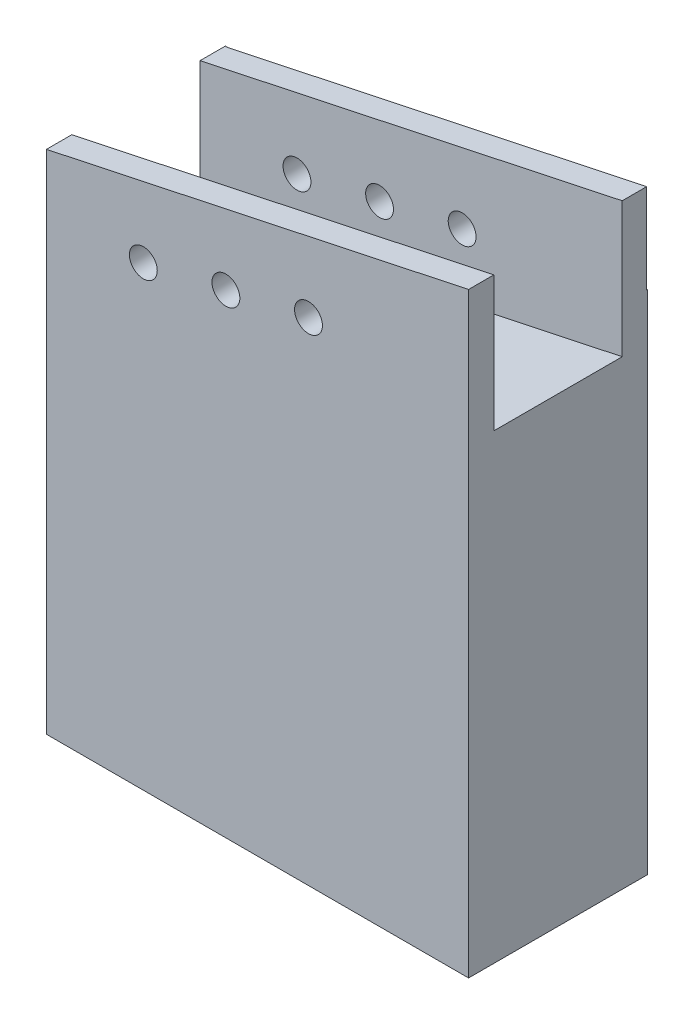
ISO-10303-21;
HEADER;
FILE_DESCRIPTION(('STEP AP214'),'2;1');
FILE_NAME('part.step','',(''),(''),'','','');
FILE_SCHEMA(('AUTOMOTIVE_DESIGN { 1 0 10303 214 1 1 1 1 }'));
ENDSEC;
DATA;
#1=APPLICATION_CONTEXT('core data for automotive mechanical design processes');
#2=APPLICATION_PROTOCOL_DEFINITION('international standard','automotive_design',2000,#1);
#3=PRODUCT_CONTEXT('',#1,'mechanical');
#4=PRODUCT('Part','Part','',(#3));
#5=PRODUCT_RELATED_PRODUCT_CATEGORY('part','',(#4));
#6=PRODUCT_DEFINITION_FORMATION('','',#4);
#7=PRODUCT_DEFINITION_CONTEXT('part definition',#1,'design');
#8=PRODUCT_DEFINITION('design','',#6,#7);
#9=PRODUCT_DEFINITION_SHAPE('','',#8);
#10=(LENGTH_UNIT() NAMED_UNIT(*) SI_UNIT(.MILLI.,.METRE.));
#11=(NAMED_UNIT(*) PLANE_ANGLE_UNIT() SI_UNIT($,.RADIAN.));
#12=(NAMED_UNIT(*) SI_UNIT($,.STERADIAN.) SOLID_ANGLE_UNIT());
#13=UNCERTAINTY_MEASURE_WITH_UNIT(LENGTH_MEASURE(1.E-05),#10,'distance_accuracy_value','');
#14=(GEOMETRIC_REPRESENTATION_CONTEXT(3) GLOBAL_UNCERTAINTY_ASSIGNED_CONTEXT((#13)) GLOBAL_UNIT_ASSIGNED_CONTEXT((#10,
#11,#12)) REPRESENTATION_CONTEXT('',''));
#15=CARTESIAN_POINT('',(0.,0.,0.));
#16=DIRECTION('',(0.,0.,1.));
#17=DIRECTION('',(1.,0.,0.));
#18=AXIS2_PLACEMENT_3D('',#15,#16,#17);
#19=CARTESIAN_POINT('',(25.,-30.,10.6));
#20=DIRECTION('',(-1.,0.,0.));
#21=DIRECTION('',(0.,0.,1.));
#22=AXIS2_PLACEMENT_3D('',#19,#20,#21);
#23=PLANE('',#22);
#24=DIRECTION('',(0.,0.,-1.));
#25=VECTOR('',#24,1.);
#26=CARTESIAN_POINT('',(25.,24.6278280835008,-7.6));
#27=LINE('',#26,#25);
#28=CARTESIAN_POINT('',(25.,24.6278280835008,7.6));
#29=VERTEX_POINT('',#28);
#30=CARTESIAN_POINT('',(25.,24.6278280835008,-7.6));
#31=VERTEX_POINT('',#30);
#32=EDGE_CURVE('E160',#29,#31,#27,.T.);
#33=ORIENTED_EDGE('',*,*,#32,.F.);
#34=DIRECTION('',(0.,1.,0.));
#35=VECTOR('',#34,1.);
#36=CARTESIAN_POINT('',(25.,40.6278280835008,7.6));
#37=LINE('',#36,#35);
#38=CARTESIAN_POINT('',(25.,40.6278280835008,7.6));
#39=VERTEX_POINT('',#38);
#40=EDGE_CURVE('E126',#29,#39,#37,.T.);
#41=ORIENTED_EDGE('',*,*,#40,.T.);
#42=DIRECTION('',(0.,0.,1.));
#43=VECTOR('',#42,1.);
#44=CARTESIAN_POINT('',(25.,40.6278280835008,7.6));
#45=LINE('',#44,#43);
#46=CARTESIAN_POINT('',(25.,40.6278280835008,10.6));
#47=VERTEX_POINT('',#46);
#48=EDGE_CURVE('E182',#39,#47,#45,.T.);
#49=ORIENTED_EDGE('',*,*,#48,.T.);
#50=DIRECTION('',(0.,1.,0.));
#51=VECTOR('',#50,1.);
#52=CARTESIAN_POINT('',(25.,-30.,10.6));
#53=LINE('',#52,#51);
#54=CARTESIAN_POINT('',(25.,-30.,10.6));
#55=VERTEX_POINT('',#54);
#56=EDGE_CURVE('E192',#55,#47,#53,.T.);
#57=ORIENTED_EDGE('',*,*,#56,.F.);
#58=DIRECTION('',(0.,0.,-1.));
#59=VECTOR('',#58,1.);
#60=CARTESIAN_POINT('',(25.,-30.,10.6));
#61=LINE('',#60,#59);
#62=CARTESIAN_POINT('',(25.,-30.,-10.6));
#63=VERTEX_POINT('',#62);
#64=EDGE_CURVE('E202',#55,#63,#61,.T.);
#65=ORIENTED_EDGE('',*,*,#64,.T.);
#66=DIRECTION('',(0.,1.,0.));
#67=VECTOR('',#66,1.);
#68=CARTESIAN_POINT('',(25.,-30.,-10.6));
#69=LINE('',#68,#67);
#70=CARTESIAN_POINT('',(25.,30.,-10.6));
#71=VERTEX_POINT('',#70);
#72=EDGE_CURVE('E188',#63,#71,#69,.T.);
#73=ORIENTED_EDGE('',*,*,#72,.T.);
#74=DIRECTION('',(0.,0.,-1.));
#75=VECTOR('',#74,1.);
#76=CARTESIAN_POINT('',(25.,30.,10.6));
#77=LINE('',#76,#75);
#78=CARTESIAN_POINT('',(25.,30.,-10.5));
#79=VERTEX_POINT('',#78);
#80=EDGE_CURVE('E11',#79,#71,#77,.T.);
#81=ORIENTED_EDGE('',*,*,#80,.F.);
#82=DIRECTION('',(0.,1.,0.));
#83=VECTOR('',#82,1.);
#84=CARTESIAN_POINT('',(25.,40.6278280835008,-10.5));
#85=LINE('',#84,#83);
#86=CARTESIAN_POINT('',(25.,40.6278280835008,-10.5));
#87=VERTEX_POINT('',#86);
#88=EDGE_CURVE('E67',#79,#87,#85,.T.);
#89=ORIENTED_EDGE('',*,*,#88,.T.);
#90=DIRECTION('',(0.,0.,1.));
#91=VECTOR('',#90,1.);
#92=CARTESIAN_POINT('',(25.,40.6278280835008,-10.5));
#93=LINE('',#92,#91);
#94=CARTESIAN_POINT('',(25.,40.6278280835008,-7.6));
#95=VERTEX_POINT('',#94);
#96=EDGE_CURVE('E169',#87,#95,#93,.T.);
#97=ORIENTED_EDGE('',*,*,#96,.T.);
#98=DIRECTION('',(0.,1.,0.));
#99=VECTOR('',#98,1.);
#100=CARTESIAN_POINT('',(25.,24.8404350956593,-7.6));
#101=LINE('',#100,#99);
#102=EDGE_CURVE('E145',#31,#95,#101,.T.);
#103=ORIENTED_EDGE('',*,*,#102,.F.);
#104=EDGE_LOOP('',(#33,#41,#49,#57,#65,#73,#81,#89,#97,#103));
#105=FACE_BOUND('',#104,.T.);
#106=ADVANCED_FACE('F50',(#105),#23,.F.);
#107=CARTESIAN_POINT('',(-25.,-30.,10.6));
#108=DIRECTION('',(1.,0.,0.));
#109=DIRECTION('',(0.,0.,-1.));
#110=AXIS2_PLACEMENT_3D('',#107,#108,#109);
#111=PLANE('',#110);
#112=DIRECTION('',(0.,1.,0.));
#113=VECTOR('',#112,1.);
#114=CARTESIAN_POINT('',(-25.,24.8404350956593,7.6));
#115=LINE('',#114,#113);
#116=CARTESIAN_POINT('',(-25.,14.,7.6));
#117=VERTEX_POINT('',#116);
#118=CARTESIAN_POINT('',(-25.,30.,7.6));
#119=VERTEX_POINT('',#118);
#120=EDGE_CURVE('E127',#117,#119,#115,.T.);
#121=ORIENTED_EDGE('',*,*,#120,.F.);
#122=DIRECTION('',(0.,0.,1.));
#123=VECTOR('',#122,1.);
#124=CARTESIAN_POINT('',(-25.,14.,-7.6));
#125=LINE('',#124,#123);
#126=CARTESIAN_POINT('',(-25.,14.,-7.6));
#127=VERTEX_POINT('',#126);
#128=EDGE_CURVE('E140',#127,#117,#125,.T.);
#129=ORIENTED_EDGE('',*,*,#128,.F.);
#130=DIRECTION('',(0.,-1.,0.));
#131=VECTOR('',#130,1.);
#132=CARTESIAN_POINT('',(-25.,24.8404350956593,-7.6));
#133=LINE('',#132,#131);
#134=CARTESIAN_POINT('',(-25.,30.,-7.6));
#135=VERTEX_POINT('',#134);
#136=EDGE_CURVE('E65',#135,#127,#133,.T.);
#137=ORIENTED_EDGE('',*,*,#136,.F.);
#138=DIRECTION('',(0.,0.,1.));
#139=VECTOR('',#138,1.);
#140=CARTESIAN_POINT('',(-25.,30.,-10.5));
#141=LINE('',#140,#139);
#142=CARTESIAN_POINT('',(-25.,30.,-10.5));
#143=VERTEX_POINT('',#142);
#144=EDGE_CURVE('E167',#143,#135,#141,.T.);
#145=ORIENTED_EDGE('',*,*,#144,.F.);
#146=DIRECTION('',(0.,0.,-1.));
#147=VECTOR('',#146,1.);
#148=CARTESIAN_POINT('',(-25.,30.,10.6));
#149=LINE('',#148,#147);
#150=CARTESIAN_POINT('',(-25.,30.,-10.6));
#151=VERTEX_POINT('',#150);
#152=EDGE_CURVE('E217',#143,#151,#149,.T.);
#153=ORIENTED_EDGE('',*,*,#152,.T.);
#154=DIRECTION('',(0.,-1.,0.));
#155=VECTOR('',#154,1.);
#156=CARTESIAN_POINT('',(-25.,-30.,-10.6));
#157=LINE('',#156,#155);
#158=CARTESIAN_POINT('',(-25.,-30.,-10.6));
#159=VERTEX_POINT('',#158);
#160=EDGE_CURVE('E209',#151,#159,#157,.T.);
#161=ORIENTED_EDGE('',*,*,#160,.T.);
#162=DIRECTION('',(0.,0.,-1.));
#163=VECTOR('',#162,1.);
#164=CARTESIAN_POINT('',(-25.,-30.,10.6));
#165=LINE('',#164,#163);
#166=CARTESIAN_POINT('',(-25.,-30.,10.6));
#167=VERTEX_POINT('',#166);
#168=EDGE_CURVE('E216',#167,#159,#165,.T.);
#169=ORIENTED_EDGE('',*,*,#168,.F.);
#170=DIRECTION('',(0.,-1.,0.));
#171=VECTOR('',#170,1.);
#172=CARTESIAN_POINT('',(-25.,-30.,10.6));
#173=LINE('',#172,#171);
#174=CARTESIAN_POINT('',(-25.,30.,10.6));
#175=VERTEX_POINT('',#174);
#176=EDGE_CURVE('E191',#175,#167,#173,.T.);
#177=ORIENTED_EDGE('',*,*,#176,.F.);
#178=EDGE_CURVE('E54',#175,#119,#149,.T.);
#179=ORIENTED_EDGE('',*,*,#178,.T.);
#180=EDGE_LOOP('',(#121,#129,#137,#145,#153,#161,#169,#177,#179));
#181=FACE_BOUND('',#180,.T.);
#182=ADVANCED_FACE('F143',(#181),#111,.F.);
#183=CARTESIAN_POINT('',(-25.,30.,10.6));
#184=DIRECTION('',(0.,-1.,0.));
#185=DIRECTION('',(0.,0.,-1.));
#186=AXIS2_PLACEMENT_3D('',#183,#184,#185);
#187=PLANE('',#186);
#188=ORIENTED_EDGE('',*,*,#152,.F.);
#189=DIRECTION('',(1.,0.,0.));
#190=VECTOR('',#189,1.);
#191=CARTESIAN_POINT('',(25.,30.,-10.5));
#192=LINE('',#191,#190);
#193=EDGE_CURVE('E156',#143,#79,#192,.T.);
#194=ORIENTED_EDGE('',*,*,#193,.T.);
#195=ORIENTED_EDGE('',*,*,#80,.T.);
#196=DIRECTION('',(-1.,0.,0.));
#197=VECTOR('',#196,1.);
#198=CARTESIAN_POINT('',(-25.,30.,-10.6));
#199=LINE('',#198,#197);
#200=EDGE_CURVE('E201',#71,#151,#199,.T.);
#201=ORIENTED_EDGE('',*,*,#200,.T.);
#202=EDGE_LOOP('',(#188,#194,#195,#201));
#203=FACE_BOUND('',#202,.T.);
#204=ADVANCED_FACE('F230',(#203),#187,.F.);
#205=CARTESIAN_POINT('',(-25.,-30.,10.6));
#206=DIRECTION('',(0.,1.,0.));
#207=DIRECTION('',(0.,0.,1.));
#208=AXIS2_PLACEMENT_3D('',#205,#206,#207);
#209=PLANE('',#208);
#210=DIRECTION('',(1.,0.,0.));
#211=VECTOR('',#210,1.);
#212=CARTESIAN_POINT('',(-25.,-30.,-10.6));
#213=LINE('',#212,#211);
#214=EDGE_CURVE('E193',#159,#63,#213,.T.);
#215=ORIENTED_EDGE('',*,*,#214,.T.);
#216=ORIENTED_EDGE('',*,*,#64,.F.);
#217=DIRECTION('',(1.,0.,0.));
#218=VECTOR('',#217,1.);
#219=CARTESIAN_POINT('',(-25.,-30.,10.6));
#220=LINE('',#219,#218);
#221=EDGE_CURVE('E200',#167,#55,#220,.T.);
#222=ORIENTED_EDGE('',*,*,#221,.F.);
#223=ORIENTED_EDGE('',*,*,#168,.T.);
#224=EDGE_LOOP('',(#215,#216,#222,#223));
#225=FACE_BOUND('',#224,.T.);
#226=ADVANCED_FACE('F240',(#225),#209,.F.);
#227=CARTESIAN_POINT('',(0.,0.,10.6));
#228=DIRECTION('',(0.,0.,-1.));
#229=DIRECTION('',(-1.,0.,0.));
#230=AXIS2_PLACEMENT_3D('',#227,#228,#229);
#231=PLANE('',#230);
#232=CARTESIAN_POINT('',(-13.5239685291888,24.1068602525402,10.6));
#233=DIRECTION('',(0.,0.,1.));
#234=DIRECTION('',(1.,0.,0.));
#235=AXIS2_PLACEMENT_3D('',#232,#233,#234);
#236=CIRCLE('',#235,1.65);
#237=CARTESIAN_POINT('',(-11.8739685291888,24.1068602525402,10.6));
#238=VERTEX_POINT('',#237);
#239=EDGE_CURVE('E332',#238,#238,#236,.T.);
#240=ORIENTED_EDGE('',*,*,#239,.F.);
#241=EDGE_LOOP('',(#240));
#242=FACE_BOUND('',#241,.T.);
#243=CARTESIAN_POINT('',(-3.74249252185072,26.1859771607178,10.6));
#244=DIRECTION('',(0.,0.,1.));
#245=DIRECTION('',(1.,0.,0.));
#246=AXIS2_PLACEMENT_3D('',#243,#244,#245);
#247=CIRCLE('',#246,1.65);
#248=CARTESIAN_POINT('',(-2.09249252185072,26.1859771607178,10.6));
#249=VERTEX_POINT('',#248);
#250=EDGE_CURVE('E338',#249,#249,#247,.T.);
#251=ORIENTED_EDGE('',*,*,#250,.F.);
#252=EDGE_LOOP('',(#251));
#253=FACE_BOUND('',#252,.T.);
#254=CARTESIAN_POINT('',(6.03898348548735,28.2650940688953,10.6));
#255=DIRECTION('',(0.,0.,1.));
#256=DIRECTION('',(1.,0.,0.));
#257=AXIS2_PLACEMENT_3D('',#254,#255,#256);
#258=CIRCLE('',#257,1.65);
#259=CARTESIAN_POINT('',(7.68898348548735,28.2650940688953,10.6));
#260=VERTEX_POINT('',#259);
#261=EDGE_CURVE('E305',#260,#260,#258,.T.);
#262=ORIENTED_EDGE('',*,*,#261,.F.);
#263=EDGE_LOOP('',(#262));
#264=FACE_BOUND('',#263,.T.);
#265=ORIENTED_EDGE('',*,*,#56,.T.);
#266=DIRECTION('',(-0.978147600733807,-0.207911690817753,0.));
#267=VECTOR('',#266,1.);
#268=CARTESIAN_POINT('',(-25.,30.,10.6));
#269=LINE('',#268,#267);
#270=EDGE_CURVE('E172',#47,#175,#269,.T.);
#271=ORIENTED_EDGE('',*,*,#270,.T.);
#272=ORIENTED_EDGE('',*,*,#176,.T.);
#273=ORIENTED_EDGE('',*,*,#221,.T.);
#274=EDGE_LOOP('',(#265,#271,#272,#273));
#275=FACE_BOUND('',#274,.T.);
#276=ADVANCED_FACE('F243',(#242,#253,#264,#275),#231,.F.);
#277=CARTESIAN_POINT('',(0.,0.,-10.6));
#278=DIRECTION('',(0.,0.,-1.));
#279=DIRECTION('',(-1.,0.,0.));
#280=AXIS2_PLACEMENT_3D('',#277,#278,#279);
#281=PLANE('',#280);
#282=CARTESIAN_POINT('',(-13.5239685291888,24.1068602525402,-10.6));
#283=DIRECTION('',(0.,0.,1.));
#284=DIRECTION('',(1.,0.,0.));
#285=AXIS2_PLACEMENT_3D('',#282,#283,#284);
#286=CIRCLE('',#285,1.65);
#287=CARTESIAN_POINT('',(-11.8739685291888,24.1068602525402,-10.6));
#288=VERTEX_POINT('',#287);
#289=EDGE_CURVE('E133',#288,#288,#286,.T.);
#290=ORIENTED_EDGE('',*,*,#289,.T.);
#291=EDGE_LOOP('',(#290));
#292=FACE_BOUND('',#291,.T.);
#293=CARTESIAN_POINT('',(-3.74249252185072,26.1859771607178,-10.6));
#294=DIRECTION('',(0.,0.,1.));
#295=DIRECTION('',(1.,0.,0.));
#296=AXIS2_PLACEMENT_3D('',#293,#294,#295);
#297=CIRCLE('',#296,1.65);
#298=CARTESIAN_POINT('',(-2.09249252185072,26.1859771607178,-10.6));
#299=VERTEX_POINT('',#298);
#300=EDGE_CURVE('E318',#299,#299,#297,.T.);
#301=ORIENTED_EDGE('',*,*,#300,.T.);
#302=EDGE_LOOP('',(#301));
#303=FACE_BOUND('',#302,.T.);
#304=CARTESIAN_POINT('',(6.03898348548735,28.2650940688953,-10.6));
#305=DIRECTION('',(0.,0.,1.));
#306=DIRECTION('',(1.,0.,0.));
#307=AXIS2_PLACEMENT_3D('',#304,#305,#306);
#308=CIRCLE('',#307,1.65);
#309=CARTESIAN_POINT('',(7.68898348548735,28.2650940688953,-10.6));
#310=VERTEX_POINT('',#309);
#311=EDGE_CURVE('E330',#310,#310,#308,.T.);
#312=ORIENTED_EDGE('',*,*,#311,.T.);
#313=EDGE_LOOP('',(#312));
#314=FACE_BOUND('',#313,.T.);
#315=ORIENTED_EDGE('',*,*,#72,.F.);
#316=ORIENTED_EDGE('',*,*,#214,.F.);
#317=ORIENTED_EDGE('',*,*,#160,.F.);
#318=ORIENTED_EDGE('',*,*,#200,.F.);
#319=EDGE_LOOP('',(#315,#316,#317,#318));
#320=FACE_BOUND('',#319,.T.);
#321=ADVANCED_FACE('F234',(#292,#303,#314,#320),#281,.T.);
#322=CARTESIAN_POINT('',(-25.,30.,7.6));
#323=DIRECTION('',(-0.207911690817753,0.978147600733807,0.));
#324=DIRECTION('',(-0.978147600733807,-0.207911690817753,0.));
#325=AXIS2_PLACEMENT_3D('',#322,#323,#324);
#326=PLANE('',#325);
#327=ORIENTED_EDGE('',*,*,#270,.F.);
#328=ORIENTED_EDGE('',*,*,#48,.F.);
#329=DIRECTION('',(-0.978147600733807,-0.207911690817753,0.));
#330=VECTOR('',#329,1.);
#331=CARTESIAN_POINT('',(-25.,30.,7.6));
#332=LINE('',#331,#330);
#333=EDGE_CURVE('E179',#39,#119,#332,.T.);
#334=ORIENTED_EDGE('',*,*,#333,.T.);
#335=ORIENTED_EDGE('',*,*,#178,.F.);
#336=EDGE_LOOP('',(#327,#328,#334,#335));
#337=FACE_BOUND('',#336,.T.);
#338=ADVANCED_FACE('F244',(#337),#326,.T.);
#339=CARTESIAN_POINT('',(0.,0.,7.6));
#340=DIRECTION('',(0.,0.,1.));
#341=DIRECTION('',(1.,0.,0.));
#342=AXIS2_PLACEMENT_3D('',#339,#340,#341);
#343=PLANE('',#342);
#344=CARTESIAN_POINT('',(-13.5239685291888,24.1068602525402,7.6));
#345=DIRECTION('',(0.,0.,1.));
#346=DIRECTION('',(1.,0.,0.));
#347=AXIS2_PLACEMENT_3D('',#344,#345,#346);
#348=CIRCLE('',#347,1.65);
#349=CARTESIAN_POINT('',(-11.8739685291888,24.1068602525402,7.6));
#350=VERTEX_POINT('',#349);
#351=EDGE_CURVE('E292',#350,#350,#348,.T.);
#352=ORIENTED_EDGE('',*,*,#351,.T.);
#353=EDGE_LOOP('',(#352));
#354=FACE_BOUND('',#353,.T.);
#355=CARTESIAN_POINT('',(-3.74249252185072,26.1859771607178,7.6));
#356=DIRECTION('',(0.,0.,1.));
#357=DIRECTION('',(1.,0.,0.));
#358=AXIS2_PLACEMENT_3D('',#355,#356,#357);
#359=CIRCLE('',#358,1.65);
#360=CARTESIAN_POINT('',(-2.09249252185072,26.1859771607178,7.6));
#361=VERTEX_POINT('',#360);
#362=EDGE_CURVE('E298',#361,#361,#359,.T.);
#363=ORIENTED_EDGE('',*,*,#362,.T.);
#364=EDGE_LOOP('',(#363));
#365=FACE_BOUND('',#364,.T.);
#366=CARTESIAN_POINT('',(6.03898348548735,28.2650940688953,7.6));
#367=DIRECTION('',(0.,0.,1.));
#368=DIRECTION('',(1.,0.,0.));
#369=AXIS2_PLACEMENT_3D('',#366,#367,#368);
#370=CIRCLE('',#369,1.65);
#371=CARTESIAN_POINT('',(7.68898348548735,28.2650940688953,7.6));
#372=VERTEX_POINT('',#371);
#373=EDGE_CURVE('E299',#372,#372,#370,.T.);
#374=ORIENTED_EDGE('',*,*,#373,.T.);
#375=EDGE_LOOP('',(#374));
#376=FACE_BOUND('',#375,.T.);
#377=ORIENTED_EDGE('',*,*,#40,.F.);
#378=DIRECTION('',(-0.978147600733807,-0.207911690817753,0.));
#379=VECTOR('',#378,1.);
#380=CARTESIAN_POINT('',(26.0002373508875,24.8404350956593,7.6));
#381=LINE('',#380,#379);
#382=EDGE_CURVE('E122',#29,#117,#381,.T.);
#383=ORIENTED_EDGE('',*,*,#382,.T.);
#384=ORIENTED_EDGE('',*,*,#120,.T.);
#385=ORIENTED_EDGE('',*,*,#333,.F.);
#386=EDGE_LOOP('',(#377,#383,#384,#385));
#387=FACE_BOUND('',#386,.T.);
#388=ADVANCED_FACE('F124',(#354,#365,#376,#387),#343,.F.);
#389=CARTESIAN_POINT('',(-25.,30.,-10.5));
#390=DIRECTION('',(-0.207911690817753,0.978147600733807,0.));
#391=DIRECTION('',(-0.978147600733807,-0.207911690817753,0.));
#392=AXIS2_PLACEMENT_3D('',#389,#390,#391);
#393=PLANE('',#392);
#394=DIRECTION('',(-0.978147600733807,-0.207911690817753,0.));
#395=VECTOR('',#394,1.);
#396=CARTESIAN_POINT('',(26.0002373508875,40.8404350956594,-7.6));
#397=LINE('',#396,#395);
#398=EDGE_CURVE('E135',#95,#135,#397,.T.);
#399=ORIENTED_EDGE('',*,*,#398,.F.);
#400=ORIENTED_EDGE('',*,*,#96,.F.);
#401=DIRECTION('',(-0.978147600733807,-0.207911690817753,0.));
#402=VECTOR('',#401,1.);
#403=CARTESIAN_POINT('',(-25.,30.,-10.5));
#404=LINE('',#403,#402);
#405=EDGE_CURVE('E164',#87,#143,#404,.T.);
#406=ORIENTED_EDGE('',*,*,#405,.T.);
#407=ORIENTED_EDGE('',*,*,#144,.T.);
#408=EDGE_LOOP('',(#399,#400,#406,#407));
#409=FACE_BOUND('',#408,.T.);
#410=ADVANCED_FACE('F252',(#409),#393,.T.);
#411=CARTESIAN_POINT('',(0.,0.,-10.5));
#412=DIRECTION('',(0.,0.,1.));
#413=DIRECTION('',(1.,0.,0.));
#414=AXIS2_PLACEMENT_3D('',#411,#412,#413);
#415=PLANE('',#414);
#416=ORIENTED_EDGE('',*,*,#193,.F.);
#417=ORIENTED_EDGE('',*,*,#405,.F.);
#418=ORIENTED_EDGE('',*,*,#88,.F.);
#419=EDGE_LOOP('',(#416,#417,#418));
#420=FACE_BOUND('',#419,.T.);
#421=ADVANCED_FACE('F255',(#420),#415,.F.);
#422=CARTESIAN_POINT('',(26.0002373508875,24.8404350956593,-7.6));
#423=DIRECTION('',(0.,0.,-1.));
#424=DIRECTION('',(-1.,0.,0.));
#425=AXIS2_PLACEMENT_3D('',#422,#423,#424);
#426=PLANE('',#425);
#427=CARTESIAN_POINT('',(-13.5239685291888,24.1068602525402,-7.6));
#428=DIRECTION('',(0.,0.,1.));
#429=DIRECTION('',(1.,0.,0.));
#430=AXIS2_PLACEMENT_3D('',#427,#428,#429);
#431=CIRCLE('',#430,1.65);
#432=CARTESIAN_POINT('',(-11.8739685291888,24.1068602525402,-7.6));
#433=VERTEX_POINT('',#432);
#434=EDGE_CURVE('E315',#433,#433,#431,.T.);
#435=ORIENTED_EDGE('',*,*,#434,.F.);
#436=EDGE_LOOP('',(#435));
#437=FACE_BOUND('',#436,.T.);
#438=CARTESIAN_POINT('',(-3.74249252185072,26.1859771607178,-7.6));
#439=DIRECTION('',(0.,0.,1.));
#440=DIRECTION('',(1.,0.,0.));
#441=AXIS2_PLACEMENT_3D('',#438,#439,#440);
#442=CIRCLE('',#441,1.65);
#443=CARTESIAN_POINT('',(-2.09249252185072,26.1859771607178,-7.6));
#444=VERTEX_POINT('',#443);
#445=EDGE_CURVE('E317',#444,#444,#442,.T.);
#446=ORIENTED_EDGE('',*,*,#445,.F.);
#447=EDGE_LOOP('',(#446));
#448=FACE_BOUND('',#447,.T.);
#449=CARTESIAN_POINT('',(6.03898348548735,28.2650940688953,-7.6));
#450=DIRECTION('',(0.,0.,1.));
#451=DIRECTION('',(1.,0.,0.));
#452=AXIS2_PLACEMENT_3D('',#449,#450,#451);
#453=CIRCLE('',#452,1.65);
#454=CARTESIAN_POINT('',(7.68898348548735,28.2650940688953,-7.6));
#455=VERTEX_POINT('',#454);
#456=EDGE_CURVE('E321',#455,#455,#453,.T.);
#457=ORIENTED_EDGE('',*,*,#456,.F.);
#458=EDGE_LOOP('',(#457));
#459=FACE_BOUND('',#458,.T.);
#460=ORIENTED_EDGE('',*,*,#102,.T.);
#461=ORIENTED_EDGE('',*,*,#398,.T.);
#462=ORIENTED_EDGE('',*,*,#136,.T.);
#463=DIRECTION('',(-0.978147600733807,-0.207911690817753,0.));
#464=VECTOR('',#463,1.);
#465=CARTESIAN_POINT('',(26.0002373508875,24.8404350956593,-7.6));
#466=LINE('',#465,#464);
#467=EDGE_CURVE('E139',#31,#127,#466,.T.);
#468=ORIENTED_EDGE('',*,*,#467,.F.);
#469=EDGE_LOOP('',(#460,#461,#462,#468));
#470=FACE_BOUND('',#469,.T.);
#471=ADVANCED_FACE('F250',(#437,#448,#459,#470),#426,.F.);
#472=CARTESIAN_POINT('',(26.0002373508875,24.8404350956593,-7.6));
#473=DIRECTION('',(0.207911690817753,-0.978147600733807,0.));
#474=DIRECTION('',(0.978147600733807,0.207911690817753,0.));
#475=AXIS2_PLACEMENT_3D('',#472,#473,#474);
#476=PLANE('',#475);
#477=ORIENTED_EDGE('',*,*,#32,.T.);
#478=ORIENTED_EDGE('',*,*,#467,.T.);
#479=ORIENTED_EDGE('',*,*,#128,.T.);
#480=ORIENTED_EDGE('',*,*,#382,.F.);
#481=EDGE_LOOP('',(#477,#478,#479,#480));
#482=FACE_BOUND('',#481,.T.);
#483=ADVANCED_FACE('F138',(#482),#476,.F.);
#484=CARTESIAN_POINT('',(6.03898348548735,28.2650940688953,-10.6));
#485=DIRECTION('',(0.,0.,1.));
#486=DIRECTION('',(1.,0.,0.));
#487=AXIS2_PLACEMENT_3D('',#484,#485,#486);
#488=CYLINDRICAL_SURFACE('',#487,1.65);
#489=ORIENTED_EDGE('',*,*,#311,.F.);
#490=EDGE_LOOP('',(#489));
#491=FACE_BOUND('',#490,.T.);
#492=ORIENTED_EDGE('',*,*,#456,.T.);
#493=EDGE_LOOP('',(#492));
#494=FACE_BOUND('',#493,.T.);
#495=ADVANCED_FACE('F261',(#491,#494),#488,.F.);
#496=CARTESIAN_POINT('',(-3.74249252185072,26.1859771607178,-10.6));
#497=DIRECTION('',(0.,0.,1.));
#498=DIRECTION('',(1.,0.,0.));
#499=AXIS2_PLACEMENT_3D('',#496,#497,#498);
#500=CYLINDRICAL_SURFACE('',#499,1.65);
#501=ORIENTED_EDGE('',*,*,#300,.F.);
#502=EDGE_LOOP('',(#501));
#503=FACE_BOUND('',#502,.T.);
#504=ORIENTED_EDGE('',*,*,#445,.T.);
#505=EDGE_LOOP('',(#504));
#506=FACE_BOUND('',#505,.T.);
#507=ADVANCED_FACE('F361',(#503,#506),#500,.F.);
#508=CARTESIAN_POINT('',(-13.5239685291888,24.1068602525402,-10.6));
#509=DIRECTION('',(0.,0.,1.));
#510=DIRECTION('',(1.,0.,0.));
#511=AXIS2_PLACEMENT_3D('',#508,#509,#510);
#512=CYLINDRICAL_SURFACE('',#511,1.65);
#513=ORIENTED_EDGE('',*,*,#289,.F.);
#514=EDGE_LOOP('',(#513));
#515=FACE_BOUND('',#514,.T.);
#516=ORIENTED_EDGE('',*,*,#434,.T.);
#517=EDGE_LOOP('',(#516));
#518=FACE_BOUND('',#517,.T.);
#519=ADVANCED_FACE('F351',(#515,#518),#512,.F.);
#520=CARTESIAN_POINT('',(6.03898348548735,28.2650940688953,10.6));
#521=DIRECTION('',(0.,0.,-1.));
#522=DIRECTION('',(-1.,0.,0.));
#523=AXIS2_PLACEMENT_3D('',#520,#521,#522);
#524=CYLINDRICAL_SURFACE('',#523,1.65);
#525=ORIENTED_EDGE('',*,*,#261,.T.);
#526=EDGE_LOOP('',(#525));
#527=FACE_BOUND('',#526,.T.);
#528=ORIENTED_EDGE('',*,*,#373,.F.);
#529=EDGE_LOOP('',(#528));
#530=FACE_BOUND('',#529,.T.);
#531=ADVANCED_FACE('F354',(#527,#530),#524,.F.);
#532=CARTESIAN_POINT('',(-3.74249252185072,26.1859771607178,10.6));
#533=DIRECTION('',(0.,0.,-1.));
#534=DIRECTION('',(-1.,0.,0.));
#535=AXIS2_PLACEMENT_3D('',#532,#533,#534);
#536=CYLINDRICAL_SURFACE('',#535,1.65);
#537=ORIENTED_EDGE('',*,*,#250,.T.);
#538=EDGE_LOOP('',(#537));
#539=FACE_BOUND('',#538,.T.);
#540=ORIENTED_EDGE('',*,*,#362,.F.);
#541=EDGE_LOOP('',(#540));
#542=FACE_BOUND('',#541,.T.);
#543=ADVANCED_FACE('F350',(#539,#542),#536,.F.);
#544=CARTESIAN_POINT('',(-13.5239685291888,24.1068602525402,10.6));
#545=DIRECTION('',(0.,0.,-1.));
#546=DIRECTION('',(-1.,0.,0.));
#547=AXIS2_PLACEMENT_3D('',#544,#545,#546);
#548=CYLINDRICAL_SURFACE('',#547,1.65);
#549=ORIENTED_EDGE('',*,*,#239,.T.);
#550=EDGE_LOOP('',(#549));
#551=FACE_BOUND('',#550,.T.);
#552=ORIENTED_EDGE('',*,*,#351,.F.);
#553=EDGE_LOOP('',(#552));
#554=FACE_BOUND('',#553,.T.);
#555=ADVANCED_FACE('F359',(#551,#554),#548,.F.);
#556=CLOSED_SHELL('',(#106,#182,#204,#226,#276,#321,#338,#388,#410,#421,#471,#483,#495,#507,
#519,#531,#543,#555));
#557=MANIFOLD_SOLID_BREP('B2',#556);
#558=ADVANCED_BREP_SHAPE_REPRESENTATION('',(#18,#557),#14);
#559=SHAPE_DEFINITION_REPRESENTATION(#9,#558);
ENDSEC;
END-ISO-10303-21;
